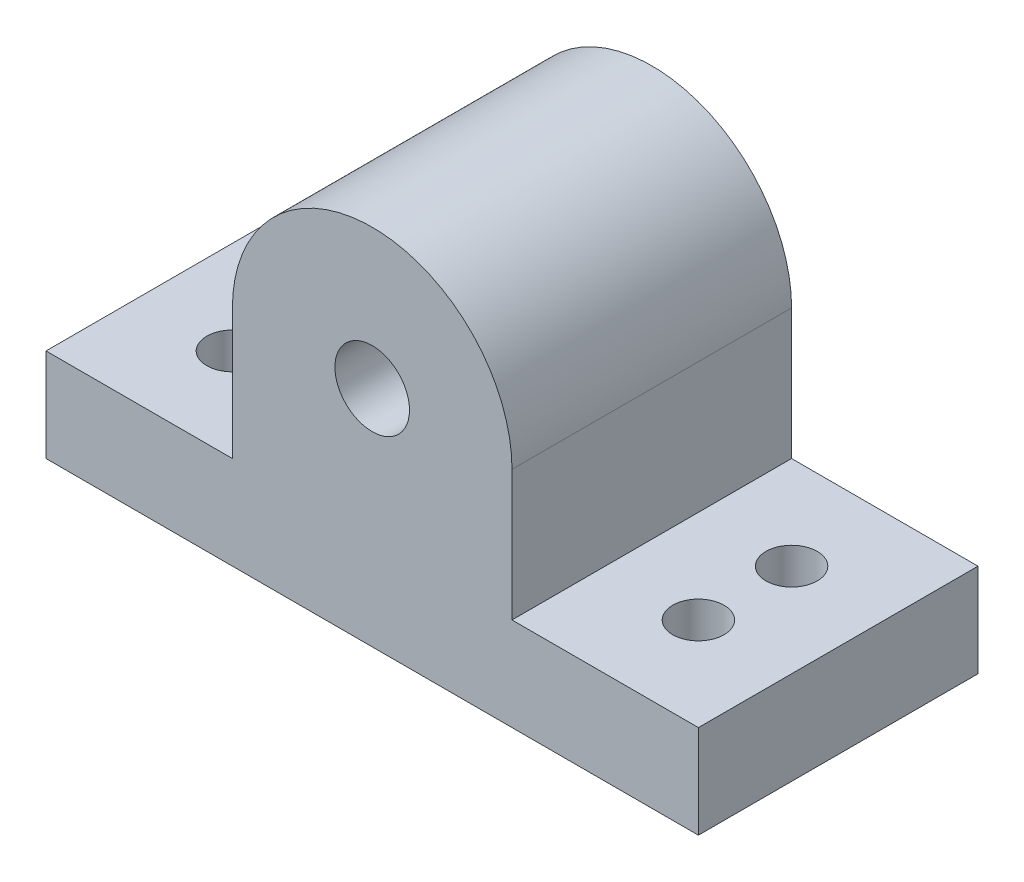
ISO-10303-21;
HEADER;
FILE_DESCRIPTION(('STEP AP214'),'2;1');
FILE_NAME('part.step','',(''),(''),'','','');
FILE_SCHEMA(('AUTOMOTIVE_DESIGN { 1 0 10303 214 1 1 1 1 }'));
ENDSEC;
DATA;
#1=APPLICATION_CONTEXT('core data for automotive mechanical design processes');
#2=APPLICATION_PROTOCOL_DEFINITION('international standard','automotive_design',2000,#1);
#3=PRODUCT_CONTEXT('',#1,'mechanical');
#4=PRODUCT('Part','Part','',(#3));
#5=PRODUCT_RELATED_PRODUCT_CATEGORY('part','',(#4));
#6=PRODUCT_DEFINITION_FORMATION('','',#4);
#7=PRODUCT_DEFINITION_CONTEXT('part definition',#1,'design');
#8=PRODUCT_DEFINITION('design','',#6,#7);
#9=PRODUCT_DEFINITION_SHAPE('','',#8);
#10=(LENGTH_UNIT() NAMED_UNIT(*) SI_UNIT(.MILLI.,.METRE.));
#11=(NAMED_UNIT(*) PLANE_ANGLE_UNIT() SI_UNIT($,.RADIAN.));
#12=(NAMED_UNIT(*) SI_UNIT($,.STERADIAN.) SOLID_ANGLE_UNIT());
#13=UNCERTAINTY_MEASURE_WITH_UNIT(LENGTH_MEASURE(1.E-05),#10,'distance_accuracy_value','');
#14=(GEOMETRIC_REPRESENTATION_CONTEXT(3) GLOBAL_UNCERTAINTY_ASSIGNED_CONTEXT((#13)) GLOBAL_UNIT_ASSIGNED_CONTEXT((#10,
#11,#12)) REPRESENTATION_CONTEXT('',''));
#15=CARTESIAN_POINT('',(0.,0.,0.));
#16=DIRECTION('',(0.,0.,1.));
#17=DIRECTION('',(1.,0.,0.));
#18=AXIS2_PLACEMENT_3D('',#15,#16,#17);
#19=CARTESIAN_POINT('',(1.06185033472857,-53.7246477517372,15.));
#20=DIRECTION('',(-1.,0.,0.));
#21=DIRECTION('',(0.,0.,1.));
#22=AXIS2_PLACEMENT_3D('',#19,#20,#21);
#23=PLANE('',#22);
#24=DIRECTION('',(0.,0.,1.));
#25=VECTOR('',#24,1.);
#26=CARTESIAN_POINT('',(1.06185033472857,-48.7246477517372,15.));
#27=LINE('',#26,#25);
#28=CARTESIAN_POINT('',(1.06185033472857,-48.7246477517372,0.));
#29=VERTEX_POINT('',#28);
#30=CARTESIAN_POINT('',(1.06185033472857,-48.7246477517372,15.));
#31=VERTEX_POINT('',#30);
#32=EDGE_CURVE('E48',#29,#31,#27,.T.);
#33=ORIENTED_EDGE('',*,*,#32,.F.);
#34=DIRECTION('',(0.,1.,0.));
#35=VECTOR('',#34,1.);
#36=CARTESIAN_POINT('',(1.06185033472857,-53.7246477517372,0.));
#37=LINE('',#36,#35);
#38=CARTESIAN_POINT('',(1.06185033472857,-41.7246477517372,0.));
#39=VERTEX_POINT('',#38);
#40=EDGE_CURVE('E66',#29,#39,#37,.T.);
#41=ORIENTED_EDGE('',*,*,#40,.T.);
#42=DIRECTION('',(0.,0.,-1.));
#43=VECTOR('',#42,1.);
#44=CARTESIAN_POINT('',(1.06185033472857,-41.7246477517372,15.));
#45=LINE('',#44,#43);
#46=CARTESIAN_POINT('',(1.06185033472857,-41.7246477517372,15.));
#47=VERTEX_POINT('',#46);
#48=EDGE_CURVE('E41',#47,#39,#45,.T.);
#49=ORIENTED_EDGE('',*,*,#48,.F.);
#50=DIRECTION('',(0.,1.,0.));
#51=VECTOR('',#50,1.);
#52=CARTESIAN_POINT('',(1.06185033472857,-53.7246477517372,15.));
#53=LINE('',#52,#51);
#54=EDGE_CURVE('E56',#31,#47,#53,.T.);
#55=ORIENTED_EDGE('',*,*,#54,.F.);
#56=EDGE_LOOP('',(#33,#41,#49,#55));
#57=FACE_BOUND('',#56,.T.);
#58=ADVANCED_FACE('F33',(#57),#23,.F.);
#59=CARTESIAN_POINT('',(-13.9381496652714,-41.7246477517372,15.));
#60=DIRECTION('',(1.,0.,0.));
#61=DIRECTION('',(0.,1.,0.));
#62=AXIS2_PLACEMENT_3D('',#59,#60,#61);
#63=PLANE('',#62);
#64=DIRECTION('',(0.,0.,-1.));
#65=VECTOR('',#64,1.);
#66=CARTESIAN_POINT('',(-13.9381496652714,-48.7246477517372,0.));
#67=LINE('',#66,#65);
#68=CARTESIAN_POINT('',(-13.9381496652714,-48.7246477517372,15.));
#69=VERTEX_POINT('',#68);
#70=CARTESIAN_POINT('',(-13.9381496652714,-48.7246477517372,0.));
#71=VERTEX_POINT('',#70);
#72=EDGE_CURVE('E134',#69,#71,#67,.T.);
#73=ORIENTED_EDGE('',*,*,#72,.F.);
#74=DIRECTION('',(0.,-1.,0.));
#75=VECTOR('',#74,1.);
#76=CARTESIAN_POINT('',(-13.9381496652714,-41.7246477517372,15.));
#77=LINE('',#76,#75);
#78=CARTESIAN_POINT('',(-13.9381496652714,-41.7246477517372,15.));
#79=VERTEX_POINT('',#78);
#80=EDGE_CURVE('E154',#79,#69,#77,.T.);
#81=ORIENTED_EDGE('',*,*,#80,.F.);
#82=DIRECTION('',(0.,0.,-1.));
#83=VECTOR('',#82,1.);
#84=CARTESIAN_POINT('',(-13.9381496652714,-41.7246477517372,15.));
#85=LINE('',#84,#83);
#86=CARTESIAN_POINT('',(-13.9381496652714,-41.7246477517372,0.));
#87=VERTEX_POINT('',#86);
#88=EDGE_CURVE('E11',#79,#87,#85,.T.);
#89=ORIENTED_EDGE('',*,*,#88,.T.);
#90=DIRECTION('',(0.,-1.,0.));
#91=VECTOR('',#90,1.);
#92=CARTESIAN_POINT('',(-13.9381496652714,-41.7246477517372,0.));
#93=LINE('',#92,#91);
#94=EDGE_CURVE('E84',#87,#71,#93,.T.);
#95=ORIENTED_EDGE('',*,*,#94,.T.);
#96=EDGE_LOOP('',(#73,#81,#89,#95));
#97=FACE_BOUND('',#96,.T.);
#98=ADVANCED_FACE('F182',(#97),#63,.F.);
#99=CARTESIAN_POINT('',(-6.43814966527143,-41.7246477517372,15.));
#100=DIRECTION('',(0.,0.,1.));
#101=DIRECTION('',(1.,0.,0.));
#102=AXIS2_PLACEMENT_3D('',#99,#100,#101);
#103=PLANE('',#102);
#104=CARTESIAN_POINT('',(-6.43814966527143,-41.7246477517372,15.));
#105=DIRECTION('',(0.,0.,1.));
#106=DIRECTION('',(1.,0.,0.));
#107=AXIS2_PLACEMENT_3D('',#104,#105,#106);
#108=CIRCLE('',#107,7.5);
#109=EDGE_CURVE('E73',#47,#79,#108,.T.);
#110=ORIENTED_EDGE('',*,*,#109,.T.);
#111=ORIENTED_EDGE('',*,*,#80,.T.);
#112=DIRECTION('',(1.,0.,0.));
#113=VECTOR('',#112,1.);
#114=CARTESIAN_POINT('',(-23.9381496652714,-48.7246477517372,15.));
#115=LINE('',#114,#113);
#116=CARTESIAN_POINT('',(-23.9381496652714,-48.7246477517372,15.));
#117=VERTEX_POINT('',#116);
#118=EDGE_CURVE('E148',#117,#69,#115,.T.);
#119=ORIENTED_EDGE('',*,*,#118,.F.);
#120=DIRECTION('',(0.,1.,0.));
#121=VECTOR('',#120,1.);
#122=CARTESIAN_POINT('',(-23.9381496652714,-53.7246477517372,15.));
#123=LINE('',#122,#121);
#124=CARTESIAN_POINT('',(-23.9381496652714,-53.7246477517372,15.));
#125=VERTEX_POINT('',#124);
#126=EDGE_CURVE('E138',#125,#117,#123,.T.);
#127=ORIENTED_EDGE('',*,*,#126,.F.);
#128=DIRECTION('',(1.,0.,0.));
#129=VECTOR('',#128,1.);
#130=CARTESIAN_POINT('',(-13.9381496652714,-53.7246477517372,15.));
#131=LINE('',#130,#129);
#132=CARTESIAN_POINT('',(11.0618503347286,-53.7246477517372,15.));
#133=VERTEX_POINT('',#132);
#134=EDGE_CURVE('E156',#125,#133,#131,.T.);
#135=ORIENTED_EDGE('',*,*,#134,.T.);
#136=DIRECTION('',(0.,-1.,0.));
#137=VECTOR('',#136,1.);
#138=CARTESIAN_POINT('',(11.0618503347286,-53.7246477517372,15.));
#139=LINE('',#138,#137);
#140=CARTESIAN_POINT('',(11.0618503347286,-48.7246477517372,15.));
#141=VERTEX_POINT('',#140);
#142=EDGE_CURVE('E120',#141,#133,#139,.T.);
#143=ORIENTED_EDGE('',*,*,#142,.F.);
#144=DIRECTION('',(-1.,0.,0.));
#145=VECTOR('',#144,1.);
#146=CARTESIAN_POINT('',(11.0618503347286,-48.7246477517372,15.));
#147=LINE('',#146,#145);
#148=EDGE_CURVE('E126',#141,#31,#147,.T.);
#149=ORIENTED_EDGE('',*,*,#148,.T.);
#150=ORIENTED_EDGE('',*,*,#54,.T.);
#151=EDGE_LOOP('',(#110,#111,#119,#127,#135,#143,#149,#150));
#152=FACE_BOUND('',#151,.T.);
#153=CARTESIAN_POINT('',(-6.43814966527143,-41.7246477517372,15.));
#154=DIRECTION('',(0.,0.,1.));
#155=DIRECTION('',(1.,0.,0.));
#156=AXIS2_PLACEMENT_3D('',#153,#154,#155);
#157=CIRCLE('',#156,2.);
#158=CARTESIAN_POINT('',(-4.43814966527143,-41.7246477517372,15.));
#159=VERTEX_POINT('',#158);
#160=EDGE_CURVE('E85',#159,#159,#157,.T.);
#161=ORIENTED_EDGE('',*,*,#160,.F.);
#162=EDGE_LOOP('',(#161));
#163=FACE_BOUND('',#162,.T.);
#164=ADVANCED_FACE('F159',(#152,#163),#103,.T.);
#165=CARTESIAN_POINT('',(-6.43814966527143,-41.7246477517372,0.));
#166=DIRECTION('',(0.,0.,1.));
#167=DIRECTION('',(1.,0.,0.));
#168=AXIS2_PLACEMENT_3D('',#165,#166,#167);
#169=PLANE('',#168);
#170=CARTESIAN_POINT('',(-6.43814966527143,-41.7246477517372,0.));
#171=DIRECTION('',(0.,0.,1.));
#172=DIRECTION('',(1.,0.,0.));
#173=AXIS2_PLACEMENT_3D('',#170,#171,#172);
#174=CIRCLE('',#173,7.5);
#175=EDGE_CURVE('E79',#39,#87,#174,.T.);
#176=ORIENTED_EDGE('',*,*,#175,.F.);
#177=ORIENTED_EDGE('',*,*,#40,.F.);
#178=DIRECTION('',(-1.,0.,0.));
#179=VECTOR('',#178,1.);
#180=CARTESIAN_POINT('',(11.0618503347286,-48.7246477517372,0.));
#181=LINE('',#180,#179);
#182=CARTESIAN_POINT('',(11.0618503347286,-48.7246477517372,0.));
#183=VERTEX_POINT('',#182);
#184=EDGE_CURVE('E122',#183,#29,#181,.T.);
#185=ORIENTED_EDGE('',*,*,#184,.F.);
#186=DIRECTION('',(0.,1.,0.));
#187=VECTOR('',#186,1.);
#188=CARTESIAN_POINT('',(11.0618503347286,-53.7246477517372,0.));
#189=LINE('',#188,#187);
#190=CARTESIAN_POINT('',(11.0618503347286,-53.7246477517372,0.));
#191=VERTEX_POINT('',#190);
#192=EDGE_CURVE('E118',#191,#183,#189,.T.);
#193=ORIENTED_EDGE('',*,*,#192,.F.);
#194=DIRECTION('',(1.,0.,0.));
#195=VECTOR('',#194,1.);
#196=CARTESIAN_POINT('',(-13.9381496652714,-53.7246477517372,0.));
#197=LINE('',#196,#195);
#198=CARTESIAN_POINT('',(-23.9381496652714,-53.7246477517372,0.));
#199=VERTEX_POINT('',#198);
#200=EDGE_CURVE('E74',#199,#191,#197,.T.);
#201=ORIENTED_EDGE('',*,*,#200,.F.);
#202=DIRECTION('',(0.,-1.,0.));
#203=VECTOR('',#202,1.);
#204=CARTESIAN_POINT('',(-23.9381496652714,-53.7246477517372,0.));
#205=LINE('',#204,#203);
#206=CARTESIAN_POINT('',(-23.9381496652714,-48.7246477517372,0.));
#207=VERTEX_POINT('',#206);
#208=EDGE_CURVE('E135',#207,#199,#205,.T.);
#209=ORIENTED_EDGE('',*,*,#208,.F.);
#210=DIRECTION('',(1.,0.,0.));
#211=VECTOR('',#210,1.);
#212=CARTESIAN_POINT('',(-23.9381496652714,-48.7246477517372,0.));
#213=LINE('',#212,#211);
#214=EDGE_CURVE('E144',#207,#71,#213,.T.);
#215=ORIENTED_EDGE('',*,*,#214,.T.);
#216=ORIENTED_EDGE('',*,*,#94,.F.);
#217=EDGE_LOOP('',(#176,#177,#185,#193,#201,#209,#215,#216));
#218=FACE_BOUND('',#217,.T.);
#219=CARTESIAN_POINT('',(-6.43814966527143,-41.7246477517372,0.));
#220=DIRECTION('',(0.,0.,1.));
#221=DIRECTION('',(1.,0.,0.));
#222=AXIS2_PLACEMENT_3D('',#219,#220,#221);
#223=CIRCLE('',#222,2.);
#224=CARTESIAN_POINT('',(-4.43814966527143,-41.7246477517372,0.));
#225=VERTEX_POINT('',#224);
#226=EDGE_CURVE('E89',#225,#225,#223,.T.);
#227=ORIENTED_EDGE('',*,*,#226,.T.);
#228=EDGE_LOOP('',(#227));
#229=FACE_BOUND('',#228,.T.);
#230=ADVANCED_FACE('F80',(#218,#229),#169,.F.);
#231=CARTESIAN_POINT('',(-6.43814966527143,-41.7246477517372,15.));
#232=DIRECTION('',(0.,0.,-1.));
#233=DIRECTION('',(-1.,0.,0.));
#234=AXIS2_PLACEMENT_3D('',#231,#232,#233);
#235=CYLINDRICAL_SURFACE('',#234,7.5);
#236=ORIENTED_EDGE('',*,*,#175,.T.);
#237=ORIENTED_EDGE('',*,*,#88,.F.);
#238=ORIENTED_EDGE('',*,*,#109,.F.);
#239=ORIENTED_EDGE('',*,*,#48,.T.);
#240=EDGE_LOOP('',(#236,#237,#238,#239));
#241=FACE_BOUND('',#240,.T.);
#242=ADVANCED_FACE('F35',(#241),#235,.T.);
#243=CARTESIAN_POINT('',(-13.9381496652714,-53.7246477517372,15.));
#244=DIRECTION('',(0.,1.,0.));
#245=DIRECTION('',(0.,0.,1.));
#246=AXIS2_PLACEMENT_3D('',#243,#244,#245);
#247=PLANE('',#246);
#248=CARTESIAN_POINT('',(-18.9381496652714,-53.7246477517372,5.));
#249=DIRECTION('',(0.,1.,0.));
#250=DIRECTION('',(0.,0.,1.));
#251=AXIS2_PLACEMENT_3D('',#248,#249,#250);
#252=CIRCLE('',#251,1.375);
#253=CARTESIAN_POINT('',(-18.9381496652714,-53.7246477517372,6.375));
#254=VERTEX_POINT('',#253);
#255=EDGE_CURVE('E231',#254,#254,#252,.T.);
#256=ORIENTED_EDGE('',*,*,#255,.T.);
#257=EDGE_LOOP('',(#256));
#258=FACE_BOUND('',#257,.T.);
#259=CARTESIAN_POINT('',(-18.9381496652714,-53.7246477517372,10.));
#260=DIRECTION('',(0.,1.,0.));
#261=DIRECTION('',(0.,0.,1.));
#262=AXIS2_PLACEMENT_3D('',#259,#260,#261);
#263=CIRCLE('',#262,1.375);
#264=CARTESIAN_POINT('',(-18.9381496652714,-53.7246477517372,11.375));
#265=VERTEX_POINT('',#264);
#266=EDGE_CURVE('E239',#265,#265,#263,.T.);
#267=ORIENTED_EDGE('',*,*,#266,.T.);
#268=EDGE_LOOP('',(#267));
#269=FACE_BOUND('',#268,.T.);
#270=CARTESIAN_POINT('',(6.06185033472857,-53.7246477517372,5.));
#271=DIRECTION('',(0.,1.,0.));
#272=DIRECTION('',(0.,0.,1.));
#273=AXIS2_PLACEMENT_3D('',#270,#271,#272);
#274=CIRCLE('',#273,1.375);
#275=CARTESIAN_POINT('',(6.06185033472857,-53.7246477517372,6.375));
#276=VERTEX_POINT('',#275);
#277=EDGE_CURVE('E245',#276,#276,#274,.T.);
#278=ORIENTED_EDGE('',*,*,#277,.T.);
#279=EDGE_LOOP('',(#278));
#280=FACE_BOUND('',#279,.T.);
#281=CARTESIAN_POINT('',(6.06185033472857,-53.7246477517372,10.));
#282=DIRECTION('',(0.,1.,0.));
#283=DIRECTION('',(0.,0.,1.));
#284=AXIS2_PLACEMENT_3D('',#281,#282,#283);
#285=CIRCLE('',#284,1.375);
#286=CARTESIAN_POINT('',(6.06185033472857,-53.7246477517372,11.375));
#287=VERTEX_POINT('',#286);
#288=EDGE_CURVE('E131',#287,#287,#285,.T.);
#289=ORIENTED_EDGE('',*,*,#288,.T.);
#290=EDGE_LOOP('',(#289));
#291=FACE_BOUND('',#290,.T.);
#292=ORIENTED_EDGE('',*,*,#200,.T.);
#293=DIRECTION('',(0.,0.,-1.));
#294=VECTOR('',#293,1.);
#295=CARTESIAN_POINT('',(11.0618503347286,-53.7246477517372,15.));
#296=LINE('',#295,#294);
#297=EDGE_CURVE('E104',#133,#191,#296,.T.);
#298=ORIENTED_EDGE('',*,*,#297,.F.);
#299=ORIENTED_EDGE('',*,*,#134,.F.);
#300=DIRECTION('',(0.,0.,1.));
#301=VECTOR('',#300,1.);
#302=CARTESIAN_POINT('',(-23.9381496652714,-53.7246477517372,0.));
#303=LINE('',#302,#301);
#304=EDGE_CURVE('E108',#199,#125,#303,.T.);
#305=ORIENTED_EDGE('',*,*,#304,.F.);
#306=EDGE_LOOP('',(#292,#298,#299,#305));
#307=FACE_BOUND('',#306,.T.);
#308=ADVANCED_FACE('F101',(#258,#269,#280,#291,#307),#247,.F.);
#309=CARTESIAN_POINT('',(-6.43814966527143,-41.7246477517372,15.));
#310=DIRECTION('',(0.,0.,-1.));
#311=DIRECTION('',(-1.,0.,0.));
#312=AXIS2_PLACEMENT_3D('',#309,#310,#311);
#313=CYLINDRICAL_SURFACE('',#312,2.);
#314=ORIENTED_EDGE('',*,*,#160,.T.);
#315=EDGE_LOOP('',(#314));
#316=FACE_BOUND('',#315,.T.);
#317=ORIENTED_EDGE('',*,*,#226,.F.);
#318=EDGE_LOOP('',(#317));
#319=FACE_BOUND('',#318,.T.);
#320=ADVANCED_FACE('F192',(#316,#319),#313,.F.);
#321=CARTESIAN_POINT('',(-23.9381496652714,-48.7246477517372,0.));
#322=DIRECTION('',(0.,-1.,0.));
#323=DIRECTION('',(0.,0.,-1.));
#324=AXIS2_PLACEMENT_3D('',#321,#322,#323);
#325=PLANE('',#324);
#326=CARTESIAN_POINT('',(-18.9381496652714,-48.7246477517372,5.));
#327=DIRECTION('',(0.,1.,0.));
#328=DIRECTION('',(0.,0.,1.));
#329=AXIS2_PLACEMENT_3D('',#326,#327,#328);
#330=CIRCLE('',#329,1.375);
#331=CARTESIAN_POINT('',(-18.9381496652714,-48.7246477517372,6.375));
#332=VERTEX_POINT('',#331);
#333=EDGE_CURVE('E234',#332,#332,#330,.T.);
#334=ORIENTED_EDGE('',*,*,#333,.F.);
#335=EDGE_LOOP('',(#334));
#336=FACE_BOUND('',#335,.T.);
#337=CARTESIAN_POINT('',(-18.9381496652714,-48.7246477517372,10.));
#338=DIRECTION('',(0.,1.,0.));
#339=DIRECTION('',(0.,0.,1.));
#340=AXIS2_PLACEMENT_3D('',#337,#338,#339);
#341=CIRCLE('',#340,1.375);
#342=CARTESIAN_POINT('',(-18.9381496652714,-48.7246477517372,11.375));
#343=VERTEX_POINT('',#342);
#344=EDGE_CURVE('E236',#343,#343,#341,.T.);
#345=ORIENTED_EDGE('',*,*,#344,.F.);
#346=EDGE_LOOP('',(#345));
#347=FACE_BOUND('',#346,.T.);
#348=ORIENTED_EDGE('',*,*,#72,.T.);
#349=ORIENTED_EDGE('',*,*,#214,.F.);
#350=DIRECTION('',(0.,0.,-1.));
#351=VECTOR('',#350,1.);
#352=CARTESIAN_POINT('',(-23.9381496652714,-48.7246477517372,0.));
#353=LINE('',#352,#351);
#354=EDGE_CURVE('E141',#117,#207,#353,.T.);
#355=ORIENTED_EDGE('',*,*,#354,.F.);
#356=ORIENTED_EDGE('',*,*,#118,.T.);
#357=EDGE_LOOP('',(#348,#349,#355,#356));
#358=FACE_BOUND('',#357,.T.);
#359=ADVANCED_FACE('F180',(#336,#347,#358),#325,.F.);
#360=CARTESIAN_POINT('',(-23.9381496652715,0.,0.));
#361=DIRECTION('',(1.,0.,0.));
#362=DIRECTION('',(0.,1.,0.));
#363=AXIS2_PLACEMENT_3D('',#360,#361,#362);
#364=PLANE('',#363);
#365=ORIENTED_EDGE('',*,*,#208,.T.);
#366=ORIENTED_EDGE('',*,*,#304,.T.);
#367=ORIENTED_EDGE('',*,*,#126,.T.);
#368=ORIENTED_EDGE('',*,*,#354,.T.);
#369=EDGE_LOOP('',(#365,#366,#367,#368));
#370=FACE_BOUND('',#369,.T.);
#371=ADVANCED_FACE('F169',(#370),#364,.F.);
#372=CARTESIAN_POINT('',(11.0618503347286,-48.7246477517372,15.));
#373=DIRECTION('',(0.,-1.,0.));
#374=DIRECTION('',(0.,0.,-1.));
#375=AXIS2_PLACEMENT_3D('',#372,#373,#374);
#376=PLANE('',#375);
#377=CARTESIAN_POINT('',(6.06185033472857,-48.7246477517372,5.));
#378=DIRECTION('',(0.,1.,0.));
#379=DIRECTION('',(0.,0.,1.));
#380=AXIS2_PLACEMENT_3D('',#377,#378,#379);
#381=CIRCLE('',#380,1.375);
#382=CARTESIAN_POINT('',(6.06185033472857,-48.7246477517372,6.375));
#383=VERTEX_POINT('',#382);
#384=EDGE_CURVE('E242',#383,#383,#381,.T.);
#385=ORIENTED_EDGE('',*,*,#384,.F.);
#386=EDGE_LOOP('',(#385));
#387=FACE_BOUND('',#386,.T.);
#388=CARTESIAN_POINT('',(6.06185033472857,-48.7246477517372,10.));
#389=DIRECTION('',(0.,1.,0.));
#390=DIRECTION('',(0.,0.,1.));
#391=AXIS2_PLACEMENT_3D('',#388,#389,#390);
#392=CIRCLE('',#391,1.375);
#393=CARTESIAN_POINT('',(6.06185033472857,-48.7246477517372,11.375));
#394=VERTEX_POINT('',#393);
#395=EDGE_CURVE('E248',#394,#394,#392,.T.);
#396=ORIENTED_EDGE('',*,*,#395,.F.);
#397=EDGE_LOOP('',(#396));
#398=FACE_BOUND('',#397,.T.);
#399=ORIENTED_EDGE('',*,*,#32,.T.);
#400=ORIENTED_EDGE('',*,*,#148,.F.);
#401=DIRECTION('',(0.,0.,1.));
#402=VECTOR('',#401,1.);
#403=CARTESIAN_POINT('',(11.0618503347286,-48.7246477517372,15.));
#404=LINE('',#403,#402);
#405=EDGE_CURVE('E124',#183,#141,#404,.T.);
#406=ORIENTED_EDGE('',*,*,#405,.F.);
#407=ORIENTED_EDGE('',*,*,#184,.T.);
#408=EDGE_LOOP('',(#399,#400,#406,#407));
#409=FACE_BOUND('',#408,.T.);
#410=ADVANCED_FACE('F205',(#387,#398,#409),#376,.F.);
#411=CARTESIAN_POINT('',(11.0618503347286,0.,0.));
#412=DIRECTION('',(-1.,0.,0.));
#413=DIRECTION('',(0.,0.,1.));
#414=AXIS2_PLACEMENT_3D('',#411,#412,#413);
#415=PLANE('',#414);
#416=ORIENTED_EDGE('',*,*,#142,.T.);
#417=ORIENTED_EDGE('',*,*,#297,.T.);
#418=ORIENTED_EDGE('',*,*,#192,.T.);
#419=ORIENTED_EDGE('',*,*,#405,.T.);
#420=EDGE_LOOP('',(#416,#417,#418,#419));
#421=FACE_BOUND('',#420,.T.);
#422=ADVANCED_FACE('F116',(#421),#415,.F.);
#423=CARTESIAN_POINT('',(6.06185033472857,-53.7246477517372,10.));
#424=DIRECTION('',(0.,1.,0.));
#425=DIRECTION('',(0.,0.,1.));
#426=AXIS2_PLACEMENT_3D('',#423,#424,#425);
#427=CYLINDRICAL_SURFACE('',#426,1.375);
#428=ORIENTED_EDGE('',*,*,#288,.F.);
#429=EDGE_LOOP('',(#428));
#430=FACE_BOUND('',#429,.T.);
#431=ORIENTED_EDGE('',*,*,#395,.T.);
#432=EDGE_LOOP('',(#431));
#433=FACE_BOUND('',#432,.T.);
#434=ADVANCED_FACE('F211',(#430,#433),#427,.F.);
#435=CARTESIAN_POINT('',(6.06185033472857,-53.7246477517372,5.));
#436=DIRECTION('',(0.,1.,0.));
#437=DIRECTION('',(0.,0.,1.));
#438=AXIS2_PLACEMENT_3D('',#435,#436,#437);
#439=CYLINDRICAL_SURFACE('',#438,1.375);
#440=ORIENTED_EDGE('',*,*,#277,.F.);
#441=EDGE_LOOP('',(#440));
#442=FACE_BOUND('',#441,.T.);
#443=ORIENTED_EDGE('',*,*,#384,.T.);
#444=EDGE_LOOP('',(#443));
#445=FACE_BOUND('',#444,.T.);
#446=ADVANCED_FACE('F214',(#442,#445),#439,.F.);
#447=CARTESIAN_POINT('',(-18.9381496652714,-53.7246477517372,10.));
#448=DIRECTION('',(0.,1.,0.));
#449=DIRECTION('',(0.,0.,1.));
#450=AXIS2_PLACEMENT_3D('',#447,#448,#449);
#451=CYLINDRICAL_SURFACE('',#450,1.375);
#452=ORIENTED_EDGE('',*,*,#266,.F.);
#453=EDGE_LOOP('',(#452));
#454=FACE_BOUND('',#453,.T.);
#455=ORIENTED_EDGE('',*,*,#344,.T.);
#456=EDGE_LOOP('',(#455));
#457=FACE_BOUND('',#456,.T.);
#458=ADVANCED_FACE('F218',(#454,#457),#451,.F.);
#459=CARTESIAN_POINT('',(-18.9381496652714,-53.7246477517372,5.));
#460=DIRECTION('',(0.,1.,0.));
#461=DIRECTION('',(0.,0.,1.));
#462=AXIS2_PLACEMENT_3D('',#459,#460,#461);
#463=CYLINDRICAL_SURFACE('',#462,1.375);
#464=ORIENTED_EDGE('',*,*,#255,.F.);
#465=EDGE_LOOP('',(#464));
#466=FACE_BOUND('',#465,.T.);
#467=ORIENTED_EDGE('',*,*,#333,.T.);
#468=EDGE_LOOP('',(#467));
#469=FACE_BOUND('',#468,.T.);
#470=ADVANCED_FACE('F222',(#466,#469),#463,.F.);
#471=CLOSED_SHELL('',(#58,#98,#164,#230,#242,#308,#320,#359,#371,#410,#422,#434,#446,#458,#470));
#472=MANIFOLD_SOLID_BREP('B2',#471);
#473=ADVANCED_BREP_SHAPE_REPRESENTATION('',(#18,#472),#14);
#474=SHAPE_DEFINITION_REPRESENTATION(#9,#473);
ENDSEC;
END-ISO-10303-21;
